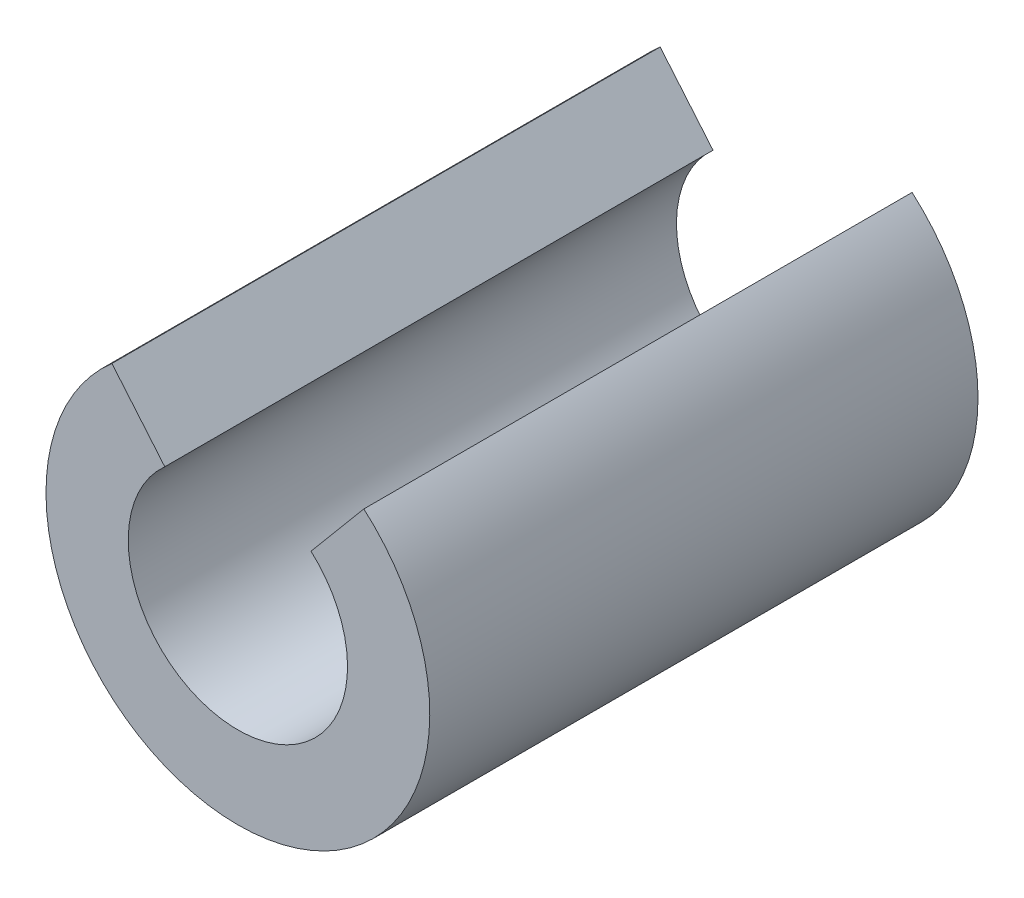
ISO-10303-21;
HEADER;
FILE_DESCRIPTION(('STEP AP214'),'2;1');
FILE_NAME('part.step','',(''),(''),'','','');
FILE_SCHEMA(('AUTOMOTIVE_DESIGN { 1 0 10303 214 1 1 1 1 }'));
ENDSEC;
DATA;
#1=APPLICATION_CONTEXT('core data for automotive mechanical design processes');
#2=APPLICATION_PROTOCOL_DEFINITION('international standard','automotive_design',2000,#1);
#3=PRODUCT_CONTEXT('',#1,'mechanical');
#4=PRODUCT('Part','Part','',(#3));
#5=PRODUCT_RELATED_PRODUCT_CATEGORY('part','',(#4));
#6=PRODUCT_DEFINITION_FORMATION('','',#4);
#7=PRODUCT_DEFINITION_CONTEXT('part definition',#1,'design');
#8=PRODUCT_DEFINITION('design','',#6,#7);
#9=PRODUCT_DEFINITION_SHAPE('','',#8);
#10=(LENGTH_UNIT() NAMED_UNIT(*) SI_UNIT(.MILLI.,.METRE.));
#11=(NAMED_UNIT(*) PLANE_ANGLE_UNIT() SI_UNIT($,.RADIAN.));
#12=(NAMED_UNIT(*) SI_UNIT($,.STERADIAN.) SOLID_ANGLE_UNIT());
#13=UNCERTAINTY_MEASURE_WITH_UNIT(LENGTH_MEASURE(1.E-05),#10,'distance_accuracy_value','');
#14=(GEOMETRIC_REPRESENTATION_CONTEXT(3) GLOBAL_UNCERTAINTY_ASSIGNED_CONTEXT((#13)) GLOBAL_UNIT_ASSIGNED_CONTEXT((#10,
#11,#12)) REPRESENTATION_CONTEXT('',''));
#15=CARTESIAN_POINT('',(0.,0.,0.));
#16=DIRECTION('',(0.,0.,1.));
#17=DIRECTION('',(1.,0.,0.));
#18=AXIS2_PLACEMENT_3D('',#15,#16,#17);
#19=CARTESIAN_POINT('',(0.,0.,15.));
#20=DIRECTION('',(0.,0.,-1.));
#21=DIRECTION('',(-1.,0.,0.));
#22=AXIS2_PLACEMENT_3D('',#19,#20,#21);
#23=CYLINDRICAL_SURFACE('',#22,10.5);
#24=CARTESIAN_POINT('',(0.,0.,-15.));
#25=DIRECTION('',(0.,0.,1.));
#26=DIRECTION('',(1.,0.,0.));
#27=AXIS2_PLACEMENT_3D('',#24,#25,#26);
#28=CIRCLE('',#27,10.5);
#29=CARTESIAN_POINT('',(-6.89336939975164,7.92031933185574,-15.));
#30=VERTEX_POINT('',#29);
#31=CARTESIAN_POINT('',(6.89336939975164,7.92031933185574,-15.));
#32=VERTEX_POINT('',#31);
#33=EDGE_CURVE('E96',#30,#32,#28,.T.);
#34=ORIENTED_EDGE('',*,*,#33,.T.);
#35=DIRECTION('',(0.,0.,-1.));
#36=VECTOR('',#35,1.);
#37=CARTESIAN_POINT('',(6.89336939975164,7.92031933185574,15.));
#38=LINE('',#37,#36);
#39=CARTESIAN_POINT('',(6.89336939975164,7.92031933185574,15.));
#40=VERTEX_POINT('',#39);
#41=EDGE_CURVE('E11',#40,#32,#38,.T.);
#42=ORIENTED_EDGE('',*,*,#41,.F.);
#43=CARTESIAN_POINT('',(0.,0.,15.));
#44=DIRECTION('',(0.,0.,1.));
#45=DIRECTION('',(1.,0.,0.));
#46=AXIS2_PLACEMENT_3D('',#43,#44,#45);
#47=CIRCLE('',#46,10.5);
#48=CARTESIAN_POINT('',(-6.89336939975164,7.92031933185574,15.));
#49=VERTEX_POINT('',#48);
#50=EDGE_CURVE('E84',#49,#40,#47,.T.);
#51=ORIENTED_EDGE('',*,*,#50,.F.);
#52=DIRECTION('',(0.,0.,-1.));
#53=VECTOR('',#52,1.);
#54=CARTESIAN_POINT('',(-6.89336939975164,7.92031933185574,15.));
#55=LINE('',#54,#53);
#56=EDGE_CURVE('E92',#49,#30,#55,.T.);
#57=ORIENTED_EDGE('',*,*,#56,.T.);
#58=EDGE_LOOP('',(#34,#42,#51,#57));
#59=FACE_BOUND('',#58,.T.);
#60=ADVANCED_FACE('F33',(#59),#23,.T.);
#61=CARTESIAN_POINT('',(6.89336939975164,7.92031933185574,15.));
#62=DIRECTION('',(0.766044443118977,-0.64278760968654,0.));
#63=DIRECTION('',(0.64278760968654,0.766044443118977,0.));
#64=AXIS2_PLACEMENT_3D('',#61,#62,#63);
#65=PLANE('',#64);
#66=DIRECTION('',(-0.64278760968654,-0.766044443118977,0.));
#67=VECTOR('',#66,1.);
#68=CARTESIAN_POINT('',(6.89336939975164,7.92031933185574,-15.));
#69=LINE('',#68,#67);
#70=CARTESIAN_POINT('',(4.,4.47213595499958,-15.));
#71=VERTEX_POINT('',#70);
#72=EDGE_CURVE('E88',#32,#71,#69,.T.);
#73=ORIENTED_EDGE('',*,*,#72,.T.);
#74=DIRECTION('',(0.,0.,-1.));
#75=VECTOR('',#74,1.);
#76=CARTESIAN_POINT('',(4.,4.47213595499958,15.));
#77=LINE('',#76,#75);
#78=CARTESIAN_POINT('',(4.,4.47213595499958,15.));
#79=VERTEX_POINT('',#78);
#80=EDGE_CURVE('E41',#79,#71,#77,.T.);
#81=ORIENTED_EDGE('',*,*,#80,.F.);
#82=DIRECTION('',(-0.64278760968654,-0.766044443118977,0.));
#83=VECTOR('',#82,1.);
#84=CARTESIAN_POINT('',(6.89336939975164,7.92031933185574,15.));
#85=LINE('',#84,#83);
#86=EDGE_CURVE('E79',#40,#79,#85,.T.);
#87=ORIENTED_EDGE('',*,*,#86,.F.);
#88=ORIENTED_EDGE('',*,*,#41,.T.);
#89=EDGE_LOOP('',(#73,#81,#87,#88));
#90=FACE_BOUND('',#89,.T.);
#91=ADVANCED_FACE('F87',(#90),#65,.F.);
#92=CARTESIAN_POINT('',(0.,0.,15.));
#93=DIRECTION('',(0.,0.,-1.));
#94=DIRECTION('',(-1.,0.,0.));
#95=AXIS2_PLACEMENT_3D('',#92,#93,#94);
#96=CYLINDRICAL_SURFACE('',#95,6.);
#97=CARTESIAN_POINT('',(0.,0.,-15.));
#98=DIRECTION('',(0.,0.,-1.));
#99=DIRECTION('',(1.,0.,0.));
#100=AXIS2_PLACEMENT_3D('',#97,#98,#99);
#101=CIRCLE('',#100,6.);
#102=CARTESIAN_POINT('',(-4.,4.47213595499958,-15.));
#103=VERTEX_POINT('',#102);
#104=EDGE_CURVE('E66',#71,#103,#101,.T.);
#105=ORIENTED_EDGE('',*,*,#104,.T.);
#106=DIRECTION('',(0.,0.,-1.));
#107=VECTOR('',#106,1.);
#108=CARTESIAN_POINT('',(-4.,4.47213595499958,15.));
#109=LINE('',#108,#107);
#110=CARTESIAN_POINT('',(-4.,4.47213595499958,15.));
#111=VERTEX_POINT('',#110);
#112=EDGE_CURVE('E89',#111,#103,#109,.T.);
#113=ORIENTED_EDGE('',*,*,#112,.F.);
#114=CARTESIAN_POINT('',(0.,0.,15.));
#115=DIRECTION('',(0.,0.,-1.));
#116=DIRECTION('',(1.,0.,0.));
#117=AXIS2_PLACEMENT_3D('',#114,#115,#116);
#118=CIRCLE('',#117,6.);
#119=EDGE_CURVE('E82',#79,#111,#118,.T.);
#120=ORIENTED_EDGE('',*,*,#119,.F.);
#121=ORIENTED_EDGE('',*,*,#80,.T.);
#122=EDGE_LOOP('',(#105,#113,#120,#121));
#123=FACE_BOUND('',#122,.T.);
#124=ADVANCED_FACE('F90',(#123),#96,.F.);
#125=CARTESIAN_POINT('',(-6.89336939975164,7.92031933185574,15.));
#126=DIRECTION('',(-0.766044443118977,-0.64278760968654,0.));
#127=DIRECTION('',(0.64278760968654,-0.766044443118977,0.));
#128=AXIS2_PLACEMENT_3D('',#125,#126,#127);
#129=PLANE('',#128);
#130=DIRECTION('',(-0.64278760968654,0.766044443118977,0.));
#131=VECTOR('',#130,1.);
#132=CARTESIAN_POINT('',(-6.89336939975164,7.92031933185574,-15.));
#133=LINE('',#132,#131);
#134=EDGE_CURVE('E72',#103,#30,#133,.T.);
#135=ORIENTED_EDGE('',*,*,#134,.T.);
#136=ORIENTED_EDGE('',*,*,#56,.F.);
#137=DIRECTION('',(-0.64278760968654,0.766044443118977,0.));
#138=VECTOR('',#137,1.);
#139=CARTESIAN_POINT('',(-6.89336939975164,7.92031933185574,15.));
#140=LINE('',#139,#138);
#141=EDGE_CURVE('E49',#111,#49,#140,.T.);
#142=ORIENTED_EDGE('',*,*,#141,.F.);
#143=ORIENTED_EDGE('',*,*,#112,.T.);
#144=EDGE_LOOP('',(#135,#136,#142,#143));
#145=FACE_BOUND('',#144,.T.);
#146=ADVANCED_FACE('F103',(#145),#129,.F.);
#147=CARTESIAN_POINT('',(0.,0.,15.));
#148=DIRECTION('',(0.,0.,1.));
#149=DIRECTION('',(1.,0.,0.));
#150=AXIS2_PLACEMENT_3D('',#147,#148,#149);
#151=PLANE('',#150);
#152=ORIENTED_EDGE('',*,*,#50,.T.);
#153=ORIENTED_EDGE('',*,*,#86,.T.);
#154=ORIENTED_EDGE('',*,*,#119,.T.);
#155=ORIENTED_EDGE('',*,*,#141,.T.);
#156=EDGE_LOOP('',(#152,#153,#154,#155));
#157=FACE_BOUND('',#156,.T.);
#158=ADVANCED_FACE('F80',(#157),#151,.T.);
#159=CARTESIAN_POINT('',(0.,0.,-15.));
#160=DIRECTION('',(0.,0.,1.));
#161=DIRECTION('',(1.,0.,0.));
#162=AXIS2_PLACEMENT_3D('',#159,#160,#161);
#163=PLANE('',#162);
#164=ORIENTED_EDGE('',*,*,#33,.F.);
#165=ORIENTED_EDGE('',*,*,#134,.F.);
#166=ORIENTED_EDGE('',*,*,#104,.F.);
#167=ORIENTED_EDGE('',*,*,#72,.F.);
#168=EDGE_LOOP('',(#164,#165,#166,#167));
#169=FACE_BOUND('',#168,.T.);
#170=ADVANCED_FACE('F106',(#169),#163,.F.);
#171=CLOSED_SHELL('',(#60,#91,#124,#146,#158,#170));
#172=MANIFOLD_SOLID_BREP('B2',#171);
#173=ADVANCED_BREP_SHAPE_REPRESENTATION('',(#18,#172),#14);
#174=SHAPE_DEFINITION_REPRESENTATION(#9,#173);
ENDSEC;
END-ISO-10303-21;
